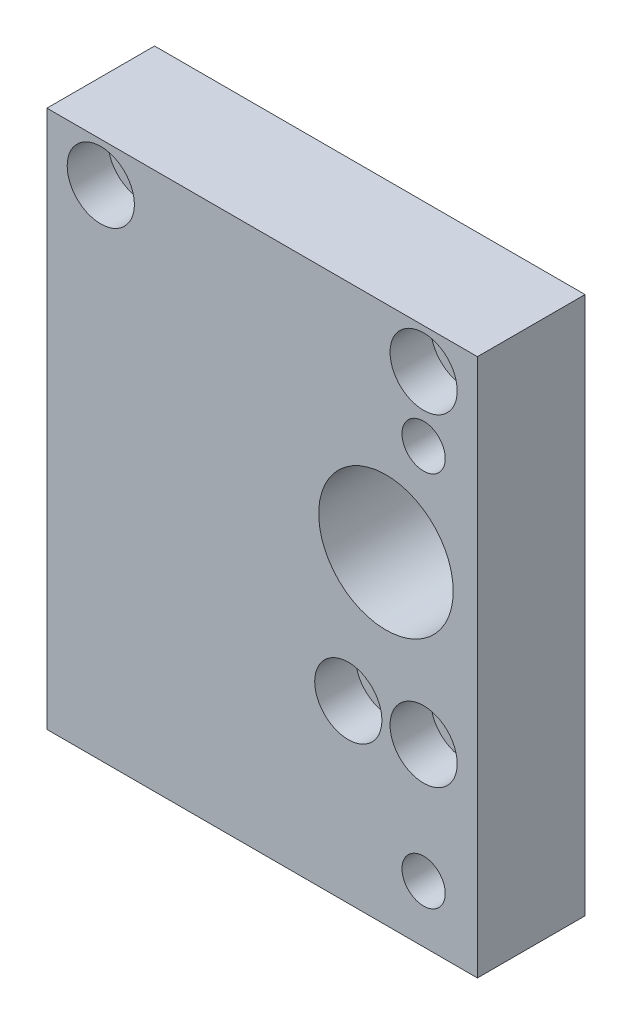
ISO-10303-21;
HEADER;
FILE_DESCRIPTION(('STEP AP214'),'2;1');
FILE_NAME('part.step','',(''),(''),'','','');
FILE_SCHEMA(('AUTOMOTIVE_DESIGN { 1 0 10303 214 1 1 1 1 }'));
ENDSEC;
DATA;
#1=APPLICATION_CONTEXT('core data for automotive mechanical design processes');
#2=APPLICATION_PROTOCOL_DEFINITION('international standard','automotive_design',2000,#1);
#3=PRODUCT_CONTEXT('',#1,'mechanical');
#4=PRODUCT('Part','Part','',(#3));
#5=PRODUCT_RELATED_PRODUCT_CATEGORY('part','',(#4));
#6=PRODUCT_DEFINITION_FORMATION('','',#4);
#7=PRODUCT_DEFINITION_CONTEXT('part definition',#1,'design');
#8=PRODUCT_DEFINITION('design','',#6,#7);
#9=PRODUCT_DEFINITION_SHAPE('','',#8);
#10=(LENGTH_UNIT() NAMED_UNIT(*) SI_UNIT(.MILLI.,.METRE.));
#11=(NAMED_UNIT(*) PLANE_ANGLE_UNIT() SI_UNIT($,.RADIAN.));
#12=(NAMED_UNIT(*) SI_UNIT($,.STERADIAN.) SOLID_ANGLE_UNIT());
#13=UNCERTAINTY_MEASURE_WITH_UNIT(LENGTH_MEASURE(1.E-05),#10,'distance_accuracy_value','');
#14=(GEOMETRIC_REPRESENTATION_CONTEXT(3) GLOBAL_UNCERTAINTY_ASSIGNED_CONTEXT((#13)) GLOBAL_UNIT_ASSIGNED_CONTEXT((#10,
#11,#12)) REPRESENTATION_CONTEXT('',''));
#15=CARTESIAN_POINT('',(0.,0.,0.));
#16=DIRECTION('',(0.,0.,1.));
#17=DIRECTION('',(1.,0.,0.));
#18=AXIS2_PLACEMENT_3D('',#15,#16,#17);
#19=CARTESIAN_POINT('',(0.,0.,12.7));
#20=DIRECTION('',(0.,0.,-1.));
#21=DIRECTION('',(-1.,0.,0.));
#22=AXIS2_PLACEMENT_3D('',#19,#20,#21);
#23=PLANE('',#22);
#24=CARTESIAN_POINT('',(19.05,-17.399,12.7));
#25=DIRECTION('',(0.,0.,-1.));
#26=DIRECTION('',(-1.,0.,0.));
#27=AXIS2_PLACEMENT_3D('',#24,#25,#26);
#28=CIRCLE('',#27,3.9624);
#29=CARTESIAN_POINT('',(15.0876,-17.399,12.7));
#30=VERTEX_POINT('',#29);
#31=EDGE_CURVE('E150',#30,#30,#28,.T.);
#32=ORIENTED_EDGE('',*,*,#31,.T.);
#33=EDGE_LOOP('',(#32));
#34=FACE_BOUND('',#33,.T.);
#35=CARTESIAN_POINT('',(19.05,20.701,12.7));
#36=DIRECTION('',(0.,0.,-1.));
#37=DIRECTION('',(-1.,0.,0.));
#38=AXIS2_PLACEMENT_3D('',#35,#36,#37);
#39=CIRCLE('',#38,3.9624);
#40=CARTESIAN_POINT('',(15.0876,20.701,12.7));
#41=VERTEX_POINT('',#40);
#42=EDGE_CURVE('E139',#41,#41,#39,.T.);
#43=ORIENTED_EDGE('',*,*,#42,.T.);
#44=EDGE_LOOP('',(#43));
#45=FACE_BOUND('',#44,.T.);
#46=CARTESIAN_POINT('',(19.05,-31.369,12.7));
#47=DIRECTION('',(0.,0.,-1.));
#48=DIRECTION('',(-1.,0.,0.));
#49=AXIS2_PLACEMENT_3D('',#46,#47,#48);
#50=CIRCLE('',#49,2.5527);
#51=CARTESIAN_POINT('',(16.4973,-31.369,12.7));
#52=VERTEX_POINT('',#51);
#53=EDGE_CURVE('E174',#52,#52,#50,.T.);
#54=ORIENTED_EDGE('',*,*,#53,.T.);
#55=EDGE_LOOP('',(#54));
#56=FACE_BOUND('',#55,.T.);
#57=CARTESIAN_POINT('',(19.05,13.081,12.7));
#58=DIRECTION('',(0.,0.,-1.));
#59=DIRECTION('',(-1.,0.,0.));
#60=AXIS2_PLACEMENT_3D('',#57,#58,#59);
#61=CIRCLE('',#60,2.5527);
#62=CARTESIAN_POINT('',(16.4973,13.081,12.7));
#63=VERTEX_POINT('',#62);
#64=EDGE_CURVE('E99',#63,#63,#61,.T.);
#65=ORIENTED_EDGE('',*,*,#64,.T.);
#66=EDGE_LOOP('',(#65));
#67=FACE_BOUND('',#66,.T.);
#68=DIRECTION('',(0.,1.,0.));
#69=VECTOR('',#68,1.);
#70=CARTESIAN_POINT('',(25.4,-25.4,12.7));
#71=LINE('',#70,#69);
#72=CARTESIAN_POINT('',(25.4,-38.1,12.7));
#73=VERTEX_POINT('',#72);
#74=CARTESIAN_POINT('',(25.4,25.4,12.7));
#75=VERTEX_POINT('',#74);
#76=EDGE_CURVE('E84',#73,#75,#71,.T.);
#77=ORIENTED_EDGE('',*,*,#76,.T.);
#78=DIRECTION('',(-1.,0.,0.));
#79=VECTOR('',#78,1.);
#80=CARTESIAN_POINT('',(-25.4,25.4,12.7));
#81=LINE('',#80,#79);
#82=CARTESIAN_POINT('',(-25.4,25.4,12.7));
#83=VERTEX_POINT('',#82);
#84=EDGE_CURVE('E52',#75,#83,#81,.T.);
#85=ORIENTED_EDGE('',*,*,#84,.T.);
#86=DIRECTION('',(0.,-1.,0.));
#87=VECTOR('',#86,1.);
#88=CARTESIAN_POINT('',(-25.4,-25.4,12.7));
#89=LINE('',#88,#87);
#90=CARTESIAN_POINT('',(-25.4,-38.1,12.7));
#91=VERTEX_POINT('',#90);
#92=EDGE_CURVE('E67',#83,#91,#89,.T.);
#93=ORIENTED_EDGE('',*,*,#92,.T.);
#94=DIRECTION('',(-1.,0.,0.));
#95=VECTOR('',#94,1.);
#96=CARTESIAN_POINT('',(-25.4,-38.1,12.7));
#97=LINE('',#96,#95);
#98=EDGE_CURVE('E98',#73,#91,#97,.T.);
#99=ORIENTED_EDGE('',*,*,#98,.F.);
#100=EDGE_LOOP('',(#77,#85,#93,#99));
#101=FACE_BOUND('',#100,.T.);
#102=CARTESIAN_POINT('',(14.605,0.,12.7));
#103=DIRECTION('',(0.,0.,1.));
#104=DIRECTION('',(1.,0.,0.));
#105=AXIS2_PLACEMENT_3D('',#102,#103,#104);
#106=CIRCLE('',#105,7.9375);
#107=CARTESIAN_POINT('',(22.5425,0.,12.7));
#108=VERTEX_POINT('',#107);
#109=EDGE_CURVE('E109',#108,#108,#106,.T.);
#110=ORIENTED_EDGE('',*,*,#109,.F.);
#111=EDGE_LOOP('',(#110));
#112=FACE_BOUND('',#111,.T.);
#113=CARTESIAN_POINT('',(10.16,-17.399,12.7));
#114=DIRECTION('',(0.,0.,-1.));
#115=DIRECTION('',(-1.,0.,0.));
#116=AXIS2_PLACEMENT_3D('',#113,#114,#115);
#117=CIRCLE('',#116,3.9624);
#118=CARTESIAN_POINT('',(6.19759999999999,-17.399,12.7));
#119=VERTEX_POINT('',#118);
#120=EDGE_CURVE('E143',#119,#119,#117,.T.);
#121=ORIENTED_EDGE('',*,*,#120,.T.);
#122=EDGE_LOOP('',(#121));
#123=FACE_BOUND('',#122,.T.);
#124=CARTESIAN_POINT('',(-19.05,20.701,12.7));
#125=DIRECTION('',(0.,0.,-1.));
#126=DIRECTION('',(-1.,0.,0.));
#127=AXIS2_PLACEMENT_3D('',#124,#125,#126);
#128=CIRCLE('',#127,3.9624);
#129=CARTESIAN_POINT('',(-23.0124,20.701,12.7));
#130=VERTEX_POINT('',#129);
#131=EDGE_CURVE('E157',#130,#130,#128,.T.);
#132=ORIENTED_EDGE('',*,*,#131,.T.);
#133=EDGE_LOOP('',(#132));
#134=FACE_BOUND('',#133,.T.);
#135=ADVANCED_FACE('F33',(#34,#45,#56,#67,#101,#112,#123,#134),#23,.F.);
#136=CARTESIAN_POINT('',(0.,0.,0.));
#137=DIRECTION('',(0.,0.,-1.));
#138=DIRECTION('',(-1.,0.,0.));
#139=AXIS2_PLACEMENT_3D('',#136,#137,#138);
#140=PLANE('',#139);
#141=CARTESIAN_POINT('',(19.05,-31.369,0.));
#142=DIRECTION('',(0.,0.,-1.));
#143=DIRECTION('',(-1.,0.,0.));
#144=AXIS2_PLACEMENT_3D('',#141,#142,#143);
#145=CIRCLE('',#144,3.9624);
#146=CARTESIAN_POINT('',(15.0876,-31.369,0.));
#147=VERTEX_POINT('',#146);
#148=EDGE_CURVE('E135',#147,#147,#145,.T.);
#149=ORIENTED_EDGE('',*,*,#148,.F.);
#150=EDGE_LOOP('',(#149));
#151=FACE_BOUND('',#150,.T.);
#152=CARTESIAN_POINT('',(19.05,13.081,0.));
#153=DIRECTION('',(0.,0.,-1.));
#154=DIRECTION('',(-1.,0.,0.));
#155=AXIS2_PLACEMENT_3D('',#152,#153,#154);
#156=CIRCLE('',#155,3.9624);
#157=CARTESIAN_POINT('',(15.0876,13.081,0.));
#158=VERTEX_POINT('',#157);
#159=EDGE_CURVE('E177',#158,#158,#156,.T.);
#160=ORIENTED_EDGE('',*,*,#159,.F.);
#161=EDGE_LOOP('',(#160));
#162=FACE_BOUND('',#161,.T.);
#163=CARTESIAN_POINT('',(10.16,-17.399,0.));
#164=DIRECTION('',(0.,0.,1.));
#165=DIRECTION('',(1.,0.,0.));
#166=AXIS2_PLACEMENT_3D('',#163,#164,#165);
#167=CIRCLE('',#166,2.5527);
#168=CARTESIAN_POINT('',(12.7127,-17.399,0.));
#169=VERTEX_POINT('',#168);
#170=EDGE_CURVE('E112',#169,#169,#167,.T.);
#171=ORIENTED_EDGE('',*,*,#170,.T.);
#172=EDGE_LOOP('',(#171));
#173=FACE_BOUND('',#172,.T.);
#174=CARTESIAN_POINT('',(19.05,20.701,0.));
#175=DIRECTION('',(0.,0.,1.));
#176=DIRECTION('',(1.,0.,0.));
#177=AXIS2_PLACEMENT_3D('',#174,#175,#176);
#178=CIRCLE('',#177,2.5527);
#179=CARTESIAN_POINT('',(21.6027,20.701,0.));
#180=VERTEX_POINT('',#179);
#181=EDGE_CURVE('E120',#180,#180,#178,.T.);
#182=ORIENTED_EDGE('',*,*,#181,.T.);
#183=EDGE_LOOP('',(#182));
#184=FACE_BOUND('',#183,.T.);
#185=DIRECTION('',(0.,1.,0.));
#186=VECTOR('',#185,1.);
#187=CARTESIAN_POINT('',(25.4,-25.4,0.));
#188=LINE('',#187,#186);
#189=CARTESIAN_POINT('',(25.4,-38.1,0.));
#190=VERTEX_POINT('',#189);
#191=CARTESIAN_POINT('',(25.4,25.4,0.));
#192=VERTEX_POINT('',#191);
#193=EDGE_CURVE('E91',#190,#192,#188,.T.);
#194=ORIENTED_EDGE('',*,*,#193,.F.);
#195=DIRECTION('',(1.,0.,0.));
#196=VECTOR('',#195,1.);
#197=CARTESIAN_POINT('',(-25.4,-38.1,0.));
#198=LINE('',#197,#196);
#199=CARTESIAN_POINT('',(-25.4,-38.1,0.));
#200=VERTEX_POINT('',#199);
#201=EDGE_CURVE('E87',#200,#190,#198,.T.);
#202=ORIENTED_EDGE('',*,*,#201,.F.);
#203=DIRECTION('',(0.,-1.,0.));
#204=VECTOR('',#203,1.);
#205=CARTESIAN_POINT('',(-25.4,-25.4,0.));
#206=LINE('',#205,#204);
#207=CARTESIAN_POINT('',(-25.4,25.4,0.));
#208=VERTEX_POINT('',#207);
#209=EDGE_CURVE('E79',#208,#200,#206,.T.);
#210=ORIENTED_EDGE('',*,*,#209,.F.);
#211=DIRECTION('',(-1.,0.,0.));
#212=VECTOR('',#211,1.);
#213=CARTESIAN_POINT('',(-25.4,25.4,0.));
#214=LINE('',#213,#212);
#215=EDGE_CURVE('E63',#192,#208,#214,.T.);
#216=ORIENTED_EDGE('',*,*,#215,.F.);
#217=EDGE_LOOP('',(#194,#202,#210,#216));
#218=FACE_BOUND('',#217,.T.);
#219=CARTESIAN_POINT('',(-19.05,20.701,0.));
#220=DIRECTION('',(0.,0.,1.));
#221=DIRECTION('',(-1.,0.,0.));
#222=AXIS2_PLACEMENT_3D('',#219,#220,#221);
#223=CIRCLE('',#222,2.5527);
#224=CARTESIAN_POINT('',(-21.6027,20.701,0.));
#225=VERTEX_POINT('',#224);
#226=EDGE_CURVE('E123',#225,#225,#223,.T.);
#227=ORIENTED_EDGE('',*,*,#226,.T.);
#228=EDGE_LOOP('',(#227));
#229=FACE_BOUND('',#228,.T.);
#230=CARTESIAN_POINT('',(19.05,-17.399,0.));
#231=DIRECTION('',(0.,0.,1.));
#232=DIRECTION('',(1.,0.,0.));
#233=AXIS2_PLACEMENT_3D('',#230,#231,#232);
#234=CIRCLE('',#233,2.5527);
#235=CARTESIAN_POINT('',(21.6027,-17.399,0.));
#236=VERTEX_POINT('',#235);
#237=EDGE_CURVE('E117',#236,#236,#234,.T.);
#238=ORIENTED_EDGE('',*,*,#237,.T.);
#239=EDGE_LOOP('',(#238));
#240=FACE_BOUND('',#239,.T.);
#241=CARTESIAN_POINT('',(14.605,0.,0.));
#242=DIRECTION('',(0.,0.,1.));
#243=DIRECTION('',(1.,0.,0.));
#244=AXIS2_PLACEMENT_3D('',#241,#242,#243);
#245=CIRCLE('',#244,7.9375);
#246=CARTESIAN_POINT('',(22.5425,0.,0.));
#247=VERTEX_POINT('',#246);
#248=EDGE_CURVE('E108',#247,#247,#245,.T.);
#249=ORIENTED_EDGE('',*,*,#248,.T.);
#250=EDGE_LOOP('',(#249));
#251=FACE_BOUND('',#250,.T.);
#252=ADVANCED_FACE('F88',(#151,#162,#173,#184,#218,#229,#240,#251),#140,.T.);
#253=CARTESIAN_POINT('',(25.4,-25.4,12.7));
#254=DIRECTION('',(-1.,0.,0.));
#255=DIRECTION('',(0.,0.,1.));
#256=AXIS2_PLACEMENT_3D('',#253,#254,#255);
#257=PLANE('',#256);
#258=ORIENTED_EDGE('',*,*,#193,.T.);
#259=DIRECTION('',(0.,0.,-1.));
#260=VECTOR('',#259,1.);
#261=CARTESIAN_POINT('',(25.4,25.4,12.7));
#262=LINE('',#261,#260);
#263=EDGE_CURVE('E11',#75,#192,#262,.T.);
#264=ORIENTED_EDGE('',*,*,#263,.F.);
#265=ORIENTED_EDGE('',*,*,#76,.F.);
#266=DIRECTION('',(0.,0.,1.));
#267=VECTOR('',#266,1.);
#268=CARTESIAN_POINT('',(25.4,-38.1,0.));
#269=LINE('',#268,#267);
#270=EDGE_CURVE('E95',#190,#73,#269,.T.);
#271=ORIENTED_EDGE('',*,*,#270,.F.);
#272=EDGE_LOOP('',(#258,#264,#265,#271));
#273=FACE_BOUND('',#272,.T.);
#274=ADVANCED_FACE('F35',(#273),#257,.F.);
#275=CARTESIAN_POINT('',(-25.4,25.4,12.7));
#276=DIRECTION('',(0.,-1.,0.));
#277=DIRECTION('',(0.,0.,-1.));
#278=AXIS2_PLACEMENT_3D('',#275,#276,#277);
#279=PLANE('',#278);
#280=ORIENTED_EDGE('',*,*,#215,.T.);
#281=DIRECTION('',(0.,0.,-1.));
#282=VECTOR('',#281,1.);
#283=CARTESIAN_POINT('',(-25.4,25.4,12.7));
#284=LINE('',#283,#282);
#285=EDGE_CURVE('E43',#83,#208,#284,.T.);
#286=ORIENTED_EDGE('',*,*,#285,.F.);
#287=ORIENTED_EDGE('',*,*,#84,.F.);
#288=ORIENTED_EDGE('',*,*,#263,.T.);
#289=EDGE_LOOP('',(#280,#286,#287,#288));
#290=FACE_BOUND('',#289,.T.);
#291=ADVANCED_FACE('F232',(#290),#279,.F.);
#292=CARTESIAN_POINT('',(-25.4,-25.4,12.7));
#293=DIRECTION('',(1.,0.,0.));
#294=DIRECTION('',(0.,0.,-1.));
#295=AXIS2_PLACEMENT_3D('',#292,#293,#294);
#296=PLANE('',#295);
#297=ORIENTED_EDGE('',*,*,#209,.T.);
#298=DIRECTION('',(0.,0.,-1.));
#299=VECTOR('',#298,1.);
#300=CARTESIAN_POINT('',(-25.4,-38.1,0.));
#301=LINE('',#300,#299);
#302=EDGE_CURVE('E83',#91,#200,#301,.T.);
#303=ORIENTED_EDGE('',*,*,#302,.F.);
#304=ORIENTED_EDGE('',*,*,#92,.F.);
#305=ORIENTED_EDGE('',*,*,#285,.T.);
#306=EDGE_LOOP('',(#297,#303,#304,#305));
#307=FACE_BOUND('',#306,.T.);
#308=ADVANCED_FACE('F81',(#307),#296,.F.);
#309=CARTESIAN_POINT('',(-19.05,20.701,12.7));
#310=DIRECTION('',(0.,0.,-1.));
#311=DIRECTION('',(-1.,0.,0.));
#312=AXIS2_PLACEMENT_3D('',#309,#310,#311);
#313=CYLINDRICAL_SURFACE('',#312,2.5527);
#314=CARTESIAN_POINT('',(-19.05,20.701,7.874));
#315=DIRECTION('',(0.,0.,-1.));
#316=DIRECTION('',(-1.,0.,0.));
#317=AXIS2_PLACEMENT_3D('',#314,#315,#316);
#318=CIRCLE('',#317,2.5527);
#319=CARTESIAN_POINT('',(-21.6027,20.701,7.874));
#320=VERTEX_POINT('',#319);
#321=EDGE_CURVE('E37',#320,#320,#318,.T.);
#322=ORIENTED_EDGE('',*,*,#321,.F.);
#323=EDGE_LOOP('',(#322));
#324=FACE_BOUND('',#323,.T.);
#325=ORIENTED_EDGE('',*,*,#226,.F.);
#326=EDGE_LOOP('',(#325));
#327=FACE_BOUND('',#326,.T.);
#328=ADVANCED_FACE('F211',(#324,#327),#313,.F.);
#329=CARTESIAN_POINT('',(19.05,20.701,12.7));
#330=DIRECTION('',(0.,0.,-1.));
#331=DIRECTION('',(-1.,0.,0.));
#332=AXIS2_PLACEMENT_3D('',#329,#330,#331);
#333=CYLINDRICAL_SURFACE('',#332,2.5527);
#334=CARTESIAN_POINT('',(19.05,20.701,7.874));
#335=DIRECTION('',(0.,0.,-1.));
#336=DIRECTION('',(-1.,0.,0.));
#337=AXIS2_PLACEMENT_3D('',#334,#335,#336);
#338=CIRCLE('',#337,2.5527);
#339=CARTESIAN_POINT('',(16.4973,20.701,7.874));
#340=VERTEX_POINT('',#339);
#341=EDGE_CURVE('E132',#340,#340,#338,.T.);
#342=ORIENTED_EDGE('',*,*,#341,.F.);
#343=EDGE_LOOP('',(#342));
#344=FACE_BOUND('',#343,.T.);
#345=ORIENTED_EDGE('',*,*,#181,.F.);
#346=EDGE_LOOP('',(#345));
#347=FACE_BOUND('',#346,.T.);
#348=ADVANCED_FACE('F208',(#344,#347),#333,.F.);
#349=CARTESIAN_POINT('',(19.05,-17.399,12.7));
#350=DIRECTION('',(0.,0.,-1.));
#351=DIRECTION('',(-1.,0.,0.));
#352=AXIS2_PLACEMENT_3D('',#349,#350,#351);
#353=CYLINDRICAL_SURFACE('',#352,2.5527);
#354=CARTESIAN_POINT('',(19.05,-17.399,7.874));
#355=DIRECTION('',(0.,0.,-1.));
#356=DIRECTION('',(-1.,0.,0.));
#357=AXIS2_PLACEMENT_3D('',#354,#355,#356);
#358=CIRCLE('',#357,2.5527);
#359=CARTESIAN_POINT('',(16.4973,-17.399,7.874));
#360=VERTEX_POINT('',#359);
#361=EDGE_CURVE('E141',#360,#360,#358,.T.);
#362=ORIENTED_EDGE('',*,*,#361,.F.);
#363=EDGE_LOOP('',(#362));
#364=FACE_BOUND('',#363,.T.);
#365=ORIENTED_EDGE('',*,*,#237,.F.);
#366=EDGE_LOOP('',(#365));
#367=FACE_BOUND('',#366,.T.);
#368=ADVANCED_FACE('F210',(#364,#367),#353,.F.);
#369=CARTESIAN_POINT('',(10.16,-17.399,12.7));
#370=DIRECTION('',(0.,0.,-1.));
#371=DIRECTION('',(-1.,0.,0.));
#372=AXIS2_PLACEMENT_3D('',#369,#370,#371);
#373=CYLINDRICAL_SURFACE('',#372,2.5527);
#374=CARTESIAN_POINT('',(10.16,-17.399,7.874));
#375=DIRECTION('',(0.,0.,-1.));
#376=DIRECTION('',(-1.,0.,0.));
#377=AXIS2_PLACEMENT_3D('',#374,#375,#376);
#378=CIRCLE('',#377,2.5527);
#379=CARTESIAN_POINT('',(7.60729999999999,-17.399,7.874));
#380=VERTEX_POINT('',#379);
#381=EDGE_CURVE('E137',#380,#380,#378,.T.);
#382=ORIENTED_EDGE('',*,*,#381,.F.);
#383=EDGE_LOOP('',(#382));
#384=FACE_BOUND('',#383,.T.);
#385=ORIENTED_EDGE('',*,*,#170,.F.);
#386=EDGE_LOOP('',(#385));
#387=FACE_BOUND('',#386,.T.);
#388=ADVANCED_FACE('F218',(#384,#387),#373,.F.);
#389=CARTESIAN_POINT('',(14.605,0.,12.7));
#390=DIRECTION('',(0.,0.,-1.));
#391=DIRECTION('',(-1.,0.,0.));
#392=AXIS2_PLACEMENT_3D('',#389,#390,#391);
#393=CYLINDRICAL_SURFACE('',#392,7.9375);
#394=ORIENTED_EDGE('',*,*,#109,.T.);
#395=EDGE_LOOP('',(#394));
#396=FACE_BOUND('',#395,.T.);
#397=ORIENTED_EDGE('',*,*,#248,.F.);
#398=EDGE_LOOP('',(#397));
#399=FACE_BOUND('',#398,.T.);
#400=ADVANCED_FACE('F264',(#396,#399),#393,.F.);
#401=CARTESIAN_POINT('',(0.,-38.1,0.));
#402=DIRECTION('',(0.,1.,0.));
#403=DIRECTION('',(0.,0.,1.));
#404=AXIS2_PLACEMENT_3D('',#401,#402,#403);
#405=PLANE('',#404);
#406=ORIENTED_EDGE('',*,*,#302,.T.);
#407=ORIENTED_EDGE('',*,*,#201,.T.);
#408=ORIENTED_EDGE('',*,*,#270,.T.);
#409=ORIENTED_EDGE('',*,*,#98,.T.);
#410=EDGE_LOOP('',(#406,#407,#408,#409));
#411=FACE_BOUND('',#410,.T.);
#412=ADVANCED_FACE('F97',(#411),#405,.F.);
#413=CARTESIAN_POINT('',(19.05,13.081,0.));
#414=DIRECTION('',(0.,0.,-1.));
#415=DIRECTION('',(-1.,0.,0.));
#416=AXIS2_PLACEMENT_3D('',#413,#414,#415);
#417=CYLINDRICAL_SURFACE('',#416,2.5527);
#418=ORIENTED_EDGE('',*,*,#64,.F.);
#419=EDGE_LOOP('',(#418));
#420=FACE_BOUND('',#419,.T.);
#421=CARTESIAN_POINT('',(19.05,13.081,4.826));
#422=DIRECTION('',(0.,0.,-1.));
#423=DIRECTION('',(-1.,0.,0.));
#424=AXIS2_PLACEMENT_3D('',#421,#422,#423);
#425=CIRCLE('',#424,2.5527);
#426=CARTESIAN_POINT('',(16.4973,13.081,4.826));
#427=VERTEX_POINT('',#426);
#428=EDGE_CURVE('E102',#427,#427,#425,.T.);
#429=ORIENTED_EDGE('',*,*,#428,.T.);
#430=EDGE_LOOP('',(#429));
#431=FACE_BOUND('',#430,.T.);
#432=ADVANCED_FACE('F185',(#420,#431),#417,.F.);
#433=CARTESIAN_POINT('',(21.6027,13.081,4.826));
#434=DIRECTION('',(0.,0.,1.));
#435=DIRECTION('',(1.,0.,0.));
#436=AXIS2_PLACEMENT_3D('',#433,#434,#435);
#437=PLANE('',#436);
#438=ORIENTED_EDGE('',*,*,#428,.F.);
#439=EDGE_LOOP('',(#438));
#440=FACE_BOUND('',#439,.T.);
#441=CARTESIAN_POINT('',(19.05,13.081,4.826));
#442=DIRECTION('',(0.,0.,-1.));
#443=DIRECTION('',(-1.,0.,0.));
#444=AXIS2_PLACEMENT_3D('',#441,#442,#443);
#445=CIRCLE('',#444,3.9624);
#446=CARTESIAN_POINT('',(15.0876,13.081,4.826));
#447=VERTEX_POINT('',#446);
#448=EDGE_CURVE('E180',#447,#447,#445,.T.);
#449=ORIENTED_EDGE('',*,*,#448,.T.);
#450=EDGE_LOOP('',(#449));
#451=FACE_BOUND('',#450,.T.);
#452=ADVANCED_FACE('F187',(#440,#451),#437,.F.);
#453=CARTESIAN_POINT('',(19.05,13.081,0.));
#454=DIRECTION('',(0.,0.,-1.));
#455=DIRECTION('',(-1.,0.,0.));
#456=AXIS2_PLACEMENT_3D('',#453,#454,#455);
#457=CYLINDRICAL_SURFACE('',#456,3.9624);
#458=ORIENTED_EDGE('',*,*,#448,.F.);
#459=EDGE_LOOP('',(#458));
#460=FACE_BOUND('',#459,.T.);
#461=ORIENTED_EDGE('',*,*,#159,.T.);
#462=EDGE_LOOP('',(#461));
#463=FACE_BOUND('',#462,.T.);
#464=ADVANCED_FACE('F190',(#460,#463),#457,.F.);
#465=CARTESIAN_POINT('',(19.05,-31.369,0.));
#466=DIRECTION('',(0.,0.,-1.));
#467=DIRECTION('',(-1.,0.,0.));
#468=AXIS2_PLACEMENT_3D('',#465,#466,#467);
#469=CYLINDRICAL_SURFACE('',#468,2.5527);
#470=ORIENTED_EDGE('',*,*,#53,.F.);
#471=EDGE_LOOP('',(#470));
#472=FACE_BOUND('',#471,.T.);
#473=CARTESIAN_POINT('',(19.05,-31.369,4.826));
#474=DIRECTION('',(0.,0.,-1.));
#475=DIRECTION('',(-1.,0.,0.));
#476=AXIS2_PLACEMENT_3D('',#473,#474,#475);
#477=CIRCLE('',#476,2.5527);
#478=CARTESIAN_POINT('',(16.4973,-31.369,4.826));
#479=VERTEX_POINT('',#478);
#480=EDGE_CURVE('E171',#479,#479,#477,.T.);
#481=ORIENTED_EDGE('',*,*,#480,.T.);
#482=EDGE_LOOP('',(#481));
#483=FACE_BOUND('',#482,.T.);
#484=ADVANCED_FACE('F196',(#472,#483),#469,.F.);
#485=CARTESIAN_POINT('',(21.6027,-31.369,4.826));
#486=DIRECTION('',(0.,0.,1.));
#487=DIRECTION('',(1.,0.,0.));
#488=AXIS2_PLACEMENT_3D('',#485,#486,#487);
#489=PLANE('',#488);
#490=ORIENTED_EDGE('',*,*,#480,.F.);
#491=EDGE_LOOP('',(#490));
#492=FACE_BOUND('',#491,.T.);
#493=CARTESIAN_POINT('',(19.05,-31.369,4.826));
#494=DIRECTION('',(0.,0.,-1.));
#495=DIRECTION('',(-1.,0.,0.));
#496=AXIS2_PLACEMENT_3D('',#493,#494,#495);
#497=CIRCLE('',#496,3.9624);
#498=CARTESIAN_POINT('',(15.0876,-31.369,4.826));
#499=VERTEX_POINT('',#498);
#500=EDGE_CURVE('E168',#499,#499,#497,.T.);
#501=ORIENTED_EDGE('',*,*,#500,.T.);
#502=EDGE_LOOP('',(#501));
#503=FACE_BOUND('',#502,.T.);
#504=ADVANCED_FACE('F281',(#492,#503),#489,.F.);
#505=CARTESIAN_POINT('',(19.05,-31.369,0.));
#506=DIRECTION('',(0.,0.,-1.));
#507=DIRECTION('',(-1.,0.,0.));
#508=AXIS2_PLACEMENT_3D('',#505,#506,#507);
#509=CYLINDRICAL_SURFACE('',#508,3.9624);
#510=ORIENTED_EDGE('',*,*,#500,.F.);
#511=EDGE_LOOP('',(#510));
#512=FACE_BOUND('',#511,.T.);
#513=ORIENTED_EDGE('',*,*,#148,.T.);
#514=EDGE_LOOP('',(#513));
#515=FACE_BOUND('',#514,.T.);
#516=ADVANCED_FACE('F285',(#512,#515),#509,.F.);
#517=CARTESIAN_POINT('',(19.05,20.701,7.874));
#518=DIRECTION('',(0.,0.,1.));
#519=DIRECTION('',(1.,0.,0.));
#520=AXIS2_PLACEMENT_3D('',#517,#518,#519);
#521=CYLINDRICAL_SURFACE('',#520,3.9624);
#522=CARTESIAN_POINT('',(19.05,20.701,7.874));
#523=DIRECTION('',(0.,0.,-1.));
#524=DIRECTION('',(-1.,0.,0.));
#525=AXIS2_PLACEMENT_3D('',#522,#523,#524);
#526=CIRCLE('',#525,3.9624);
#527=CARTESIAN_POINT('',(15.0876,20.701,7.874));
#528=VERTEX_POINT('',#527);
#529=EDGE_CURVE('E136',#528,#528,#526,.T.);
#530=ORIENTED_EDGE('',*,*,#529,.T.);
#531=EDGE_LOOP('',(#530));
#532=FACE_BOUND('',#531,.T.);
#533=ORIENTED_EDGE('',*,*,#42,.F.);
#534=EDGE_LOOP('',(#533));
#535=FACE_BOUND('',#534,.T.);
#536=ADVANCED_FACE('F289',(#532,#535),#521,.F.);
#537=CARTESIAN_POINT('',(19.05,20.701,7.874));
#538=DIRECTION('',(0.,0.,-1.));
#539=DIRECTION('',(-1.,0.,0.));
#540=AXIS2_PLACEMENT_3D('',#537,#538,#539);
#541=PLANE('',#540);
#542=ORIENTED_EDGE('',*,*,#341,.T.);
#543=EDGE_LOOP('',(#542));
#544=FACE_BOUND('',#543,.T.);
#545=ORIENTED_EDGE('',*,*,#529,.F.);
#546=EDGE_LOOP('',(#545));
#547=FACE_BOUND('',#546,.T.);
#548=ADVANCED_FACE('F293',(#544,#547),#541,.F.);
#549=CARTESIAN_POINT('',(10.16,-17.399,7.874));
#550=DIRECTION('',(0.,0.,1.));
#551=DIRECTION('',(1.,0.,0.));
#552=AXIS2_PLACEMENT_3D('',#549,#550,#551);
#553=CYLINDRICAL_SURFACE('',#552,3.9624);
#554=CARTESIAN_POINT('',(10.16,-17.399,7.874));
#555=DIRECTION('',(0.,0.,-1.));
#556=DIRECTION('',(-1.,0.,0.));
#557=AXIS2_PLACEMENT_3D('',#554,#555,#556);
#558=CIRCLE('',#557,3.9624);
#559=CARTESIAN_POINT('',(6.19759999999999,-17.399,7.874));
#560=VERTEX_POINT('',#559);
#561=EDGE_CURVE('E140',#560,#560,#558,.T.);
#562=ORIENTED_EDGE('',*,*,#561,.T.);
#563=EDGE_LOOP('',(#562));
#564=FACE_BOUND('',#563,.T.);
#565=ORIENTED_EDGE('',*,*,#120,.F.);
#566=EDGE_LOOP('',(#565));
#567=FACE_BOUND('',#566,.T.);
#568=ADVANCED_FACE('F297',(#564,#567),#553,.F.);
#569=CARTESIAN_POINT('',(10.16,-17.399,7.874));
#570=DIRECTION('',(0.,0.,-1.));
#571=DIRECTION('',(-1.,0.,0.));
#572=AXIS2_PLACEMENT_3D('',#569,#570,#571);
#573=PLANE('',#572);
#574=ORIENTED_EDGE('',*,*,#381,.T.);
#575=EDGE_LOOP('',(#574));
#576=FACE_BOUND('',#575,.T.);
#577=ORIENTED_EDGE('',*,*,#561,.F.);
#578=EDGE_LOOP('',(#577));
#579=FACE_BOUND('',#578,.T.);
#580=ADVANCED_FACE('F301',(#576,#579),#573,.F.);
#581=CARTESIAN_POINT('',(19.05,-17.399,7.874));
#582=DIRECTION('',(0.,0.,1.));
#583=DIRECTION('',(1.,0.,0.));
#584=AXIS2_PLACEMENT_3D('',#581,#582,#583);
#585=CYLINDRICAL_SURFACE('',#584,3.9624);
#586=CARTESIAN_POINT('',(19.05,-17.399,7.874));
#587=DIRECTION('',(0.,0.,-1.));
#588=DIRECTION('',(-1.,0.,0.));
#589=AXIS2_PLACEMENT_3D('',#586,#587,#588);
#590=CIRCLE('',#589,3.9624);
#591=CARTESIAN_POINT('',(15.0876,-17.399,7.874));
#592=VERTEX_POINT('',#591);
#593=EDGE_CURVE('E144',#592,#592,#590,.T.);
#594=ORIENTED_EDGE('',*,*,#593,.T.);
#595=EDGE_LOOP('',(#594));
#596=FACE_BOUND('',#595,.T.);
#597=ORIENTED_EDGE('',*,*,#31,.F.);
#598=EDGE_LOOP('',(#597));
#599=FACE_BOUND('',#598,.T.);
#600=ADVANCED_FACE('F305',(#596,#599),#585,.F.);
#601=CARTESIAN_POINT('',(19.05,-17.399,7.874));
#602=DIRECTION('',(0.,0.,-1.));
#603=DIRECTION('',(-1.,0.,0.));
#604=AXIS2_PLACEMENT_3D('',#601,#602,#603);
#605=PLANE('',#604);
#606=ORIENTED_EDGE('',*,*,#361,.T.);
#607=EDGE_LOOP('',(#606));
#608=FACE_BOUND('',#607,.T.);
#609=ORIENTED_EDGE('',*,*,#593,.F.);
#610=EDGE_LOOP('',(#609));
#611=FACE_BOUND('',#610,.T.);
#612=ADVANCED_FACE('F309',(#608,#611),#605,.F.);
#613=CARTESIAN_POINT('',(-19.05,20.701,7.874));
#614=DIRECTION('',(0.,0.,1.));
#615=DIRECTION('',(1.,0.,0.));
#616=AXIS2_PLACEMENT_3D('',#613,#614,#615);
#617=CYLINDRICAL_SURFACE('',#616,3.9624);
#618=CARTESIAN_POINT('',(-19.05,20.701,7.874));
#619=DIRECTION('',(0.,0.,-1.));
#620=DIRECTION('',(-1.,0.,0.));
#621=AXIS2_PLACEMENT_3D('',#618,#619,#620);
#622=CIRCLE('',#621,3.9624);
#623=CARTESIAN_POINT('',(-23.0124,20.701,7.874));
#624=VERTEX_POINT('',#623);
#625=EDGE_CURVE('E248',#624,#624,#622,.T.);
#626=ORIENTED_EDGE('',*,*,#625,.T.);
#627=EDGE_LOOP('',(#626));
#628=FACE_BOUND('',#627,.T.);
#629=ORIENTED_EDGE('',*,*,#131,.F.);
#630=EDGE_LOOP('',(#629));
#631=FACE_BOUND('',#630,.T.);
#632=ADVANCED_FACE('F312',(#628,#631),#617,.F.);
#633=CARTESIAN_POINT('',(-19.05,20.701,7.874));
#634=DIRECTION('',(0.,0.,-1.));
#635=DIRECTION('',(-1.,0.,0.));
#636=AXIS2_PLACEMENT_3D('',#633,#634,#635);
#637=PLANE('',#636);
#638=ORIENTED_EDGE('',*,*,#321,.T.);
#639=EDGE_LOOP('',(#638));
#640=FACE_BOUND('',#639,.T.);
#641=ORIENTED_EDGE('',*,*,#625,.F.);
#642=EDGE_LOOP('',(#641));
#643=FACE_BOUND('',#642,.T.);
#644=ADVANCED_FACE('F255',(#640,#643),#637,.F.);
#645=CLOSED_SHELL('',(#135,#252,#274,#291,#308,#328,#348,#368,#388,#400,#412,#432,#452,#464,
#484,#504,#516,#536,#548,#568,#580,#600,#612,#632,#644));
#646=MANIFOLD_SOLID_BREP('B2',#645);
#647=ADVANCED_BREP_SHAPE_REPRESENTATION('',(#18,#646),#14);
#648=SHAPE_DEFINITION_REPRESENTATION(#9,#647);
ENDSEC;
END-ISO-10303-21;
